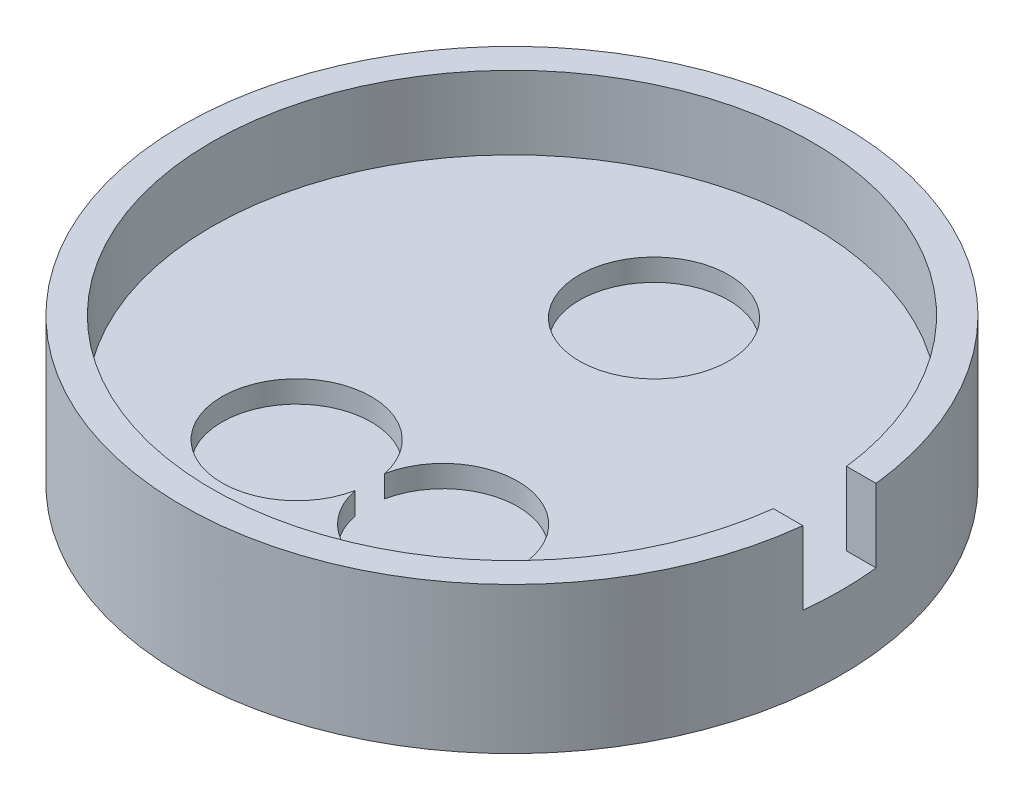
ISO-10303-21;
HEADER;
FILE_DESCRIPTION(('STEP AP214'),'2;1');
FILE_NAME('part.step','',(''),(''),'','','');
FILE_SCHEMA(('AUTOMOTIVE_DESIGN { 1 0 10303 214 1 1 1 1 }'));
ENDSEC;
DATA;
#1=APPLICATION_CONTEXT('core data for automotive mechanical design processes');
#2=APPLICATION_PROTOCOL_DEFINITION('international standard','automotive_design',2000,#1);
#3=PRODUCT_CONTEXT('',#1,'mechanical');
#4=PRODUCT('Part','Part','',(#3));
#5=PRODUCT_RELATED_PRODUCT_CATEGORY('part','',(#4));
#6=PRODUCT_DEFINITION_FORMATION('','',#4);
#7=PRODUCT_DEFINITION_CONTEXT('part definition',#1,'design');
#8=PRODUCT_DEFINITION('design','',#6,#7);
#9=PRODUCT_DEFINITION_SHAPE('','',#8);
#10=(LENGTH_UNIT() NAMED_UNIT(*) SI_UNIT(.MILLI.,.METRE.));
#11=(NAMED_UNIT(*) PLANE_ANGLE_UNIT() SI_UNIT($,.RADIAN.));
#12=(NAMED_UNIT(*) SI_UNIT($,.STERADIAN.) SOLID_ANGLE_UNIT());
#13=UNCERTAINTY_MEASURE_WITH_UNIT(LENGTH_MEASURE(1.E-05),#10,'distance_accuracy_value','');
#14=(GEOMETRIC_REPRESENTATION_CONTEXT(3) GLOBAL_UNCERTAINTY_ASSIGNED_CONTEXT((#13)) GLOBAL_UNIT_ASSIGNED_CONTEXT((#10,
#11,#12)) REPRESENTATION_CONTEXT('',''));
#15=CARTESIAN_POINT('',(0.,0.,0.));
#16=DIRECTION('',(0.,0.,1.));
#17=DIRECTION('',(1.,0.,0.));
#18=AXIS2_PLACEMENT_3D('',#15,#16,#17);
#19=CARTESIAN_POINT('',(0.,5.,0.));
#20=DIRECTION('',(0.,1.,0.));
#21=DIRECTION('',(0.,0.,1.));
#22=AXIS2_PLACEMENT_3D('',#19,#20,#21);
#23=PLANE('',#22);
#24=DIRECTION('',(-1.,0.,0.));
#25=VECTOR('',#24,1.);
#26=CARTESIAN_POINT('',(0.,5.,-2.5));
#27=LINE('',#26,#25);
#28=CARTESIAN_POINT('',(22.3606797749979,5.,-2.5));
#29=VERTEX_POINT('',#28);
#30=CARTESIAN_POINT('',(20.3469899493758,5.,-2.5));
#31=VERTEX_POINT('',#30);
#32=EDGE_CURVE('E154',#29,#31,#27,.T.);
#33=ORIENTED_EDGE('',*,*,#32,.F.);
#34=CARTESIAN_POINT('',(0.,5.,0.));
#35=DIRECTION('',(0.,1.,0.));
#36=DIRECTION('',(0.,0.,1.));
#37=AXIS2_PLACEMENT_3D('',#34,#35,#36);
#38=CIRCLE('',#37,22.5);
#39=CARTESIAN_POINT('',(22.3606797749979,5.,2.5));
#40=VERTEX_POINT('',#39);
#41=EDGE_CURVE('E12',#29,#40,#38,.T.);
#42=ORIENTED_EDGE('',*,*,#41,.T.);
#43=DIRECTION('',(1.,0.,0.));
#44=VECTOR('',#43,1.);
#45=CARTESIAN_POINT('',(0.,5.,2.5));
#46=LINE('',#45,#44);
#47=CARTESIAN_POINT('',(20.3469899493758,5.,2.5));
#48=VERTEX_POINT('',#47);
#49=EDGE_CURVE('E104',#48,#40,#46,.T.);
#50=ORIENTED_EDGE('',*,*,#49,.F.);
#51=CARTESIAN_POINT('',(0.,5.,0.));
#52=DIRECTION('',(0.,1.,0.));
#53=DIRECTION('',(0.,0.,1.));
#54=AXIS2_PLACEMENT_3D('',#51,#52,#53);
#55=CIRCLE('',#54,20.5);
#56=EDGE_CURVE('E53',#31,#48,#55,.T.);
#57=ORIENTED_EDGE('',*,*,#56,.F.);
#58=EDGE_LOOP('',(#33,#42,#50,#57));
#59=FACE_BOUND('',#58,.T.);
#60=ADVANCED_FACE('F45',(#59),#23,.T.);
#61=CARTESIAN_POINT('',(0.,5.,0.));
#62=DIRECTION('',(0.,-1.,0.));
#63=DIRECTION('',(0.,0.,-1.));
#64=AXIS2_PLACEMENT_3D('',#61,#62,#63);
#65=CYLINDRICAL_SURFACE('',#64,22.5);
#66=ORIENTED_EDGE('',*,*,#41,.F.);
#67=DIRECTION('',(0.,-1.,0.));
#68=VECTOR('',#67,1.);
#69=CARTESIAN_POINT('',(22.3606797749979,5.,-2.5));
#70=LINE('',#69,#68);
#71=CARTESIAN_POINT('',(22.3606797749979,0.,-2.5));
#72=VERTEX_POINT('',#71);
#73=EDGE_CURVE('E119',#29,#72,#70,.T.);
#74=ORIENTED_EDGE('',*,*,#73,.T.);
#75=CARTESIAN_POINT('',(0.,0.,0.));
#76=DIRECTION('',(0.,1.,0.));
#77=DIRECTION('',(0.,0.,1.));
#78=AXIS2_PLACEMENT_3D('',#75,#76,#77);
#79=CIRCLE('',#78,22.5);
#80=CARTESIAN_POINT('',(22.3606797749979,0.,2.5));
#81=VERTEX_POINT('',#80);
#82=EDGE_CURVE('E113',#81,#72,#79,.T.);
#83=ORIENTED_EDGE('',*,*,#82,.F.);
#84=DIRECTION('',(0.,-1.,0.));
#85=VECTOR('',#84,1.);
#86=CARTESIAN_POINT('',(22.3606797749979,5.,2.5));
#87=LINE('',#86,#85);
#88=EDGE_CURVE('E98',#81,#40,#87,.F.);
#89=ORIENTED_EDGE('',*,*,#88,.T.);
#90=EDGE_LOOP('',(#66,#74,#83,#89));
#91=FACE_BOUND('',#90,.T.);
#92=CARTESIAN_POINT('',(0.,-5.,0.));
#93=DIRECTION('',(0.,1.,0.));
#94=DIRECTION('',(0.,0.,1.));
#95=AXIS2_PLACEMENT_3D('',#92,#93,#94);
#96=CIRCLE('',#95,22.5);
#97=CARTESIAN_POINT('',(0.,-5.,22.5));
#98=VERTEX_POINT('',#97);
#99=EDGE_CURVE('E130',#98,#98,#96,.T.);
#100=ORIENTED_EDGE('',*,*,#99,.T.);
#101=EDGE_LOOP('',(#100));
#102=FACE_BOUND('',#101,.T.);
#103=ADVANCED_FACE('F47',(#91,#102),#65,.T.);
#104=CARTESIAN_POINT('',(0.,5.,0.));
#105=DIRECTION('',(0.,-1.,0.));
#106=DIRECTION('',(0.,0.,-1.));
#107=AXIS2_PLACEMENT_3D('',#104,#105,#106);
#108=CYLINDRICAL_SURFACE('',#107,20.5);
#109=DIRECTION('',(0.,-1.,0.));
#110=VECTOR('',#109,1.);
#111=CARTESIAN_POINT('',(20.3469899493758,5.,-2.5));
#112=LINE('',#111,#110);
#113=CARTESIAN_POINT('',(20.3469899493758,0.,-2.5));
#114=VERTEX_POINT('',#113);
#115=EDGE_CURVE('E108',#31,#114,#112,.T.);
#116=ORIENTED_EDGE('',*,*,#115,.F.);
#117=ORIENTED_EDGE('',*,*,#56,.T.);
#118=DIRECTION('',(0.,-1.,0.));
#119=VECTOR('',#118,1.);
#120=CARTESIAN_POINT('',(20.3469899493758,5.,2.5));
#121=LINE('',#120,#119);
#122=CARTESIAN_POINT('',(20.3469899493758,0.,2.5));
#123=VERTEX_POINT('',#122);
#124=EDGE_CURVE('E109',#123,#48,#121,.F.);
#125=ORIENTED_EDGE('',*,*,#124,.F.);
#126=CARTESIAN_POINT('',(0.,0.,0.));
#127=DIRECTION('',(0.,1.,0.));
#128=DIRECTION('',(0.,0.,1.));
#129=AXIS2_PLACEMENT_3D('',#126,#127,#128);
#130=CIRCLE('',#129,20.5);
#131=EDGE_CURVE('E115',#114,#123,#130,.T.);
#132=ORIENTED_EDGE('',*,*,#131,.F.);
#133=EDGE_LOOP('',(#116,#117,#125,#132));
#134=FACE_BOUND('',#133,.T.);
#135=ADVANCED_FACE('F151',(#134),#108,.F.);
#136=CARTESIAN_POINT('',(0.,0.,0.));
#137=DIRECTION('',(0.,1.,0.));
#138=DIRECTION('',(0.,0.,1.));
#139=AXIS2_PLACEMENT_3D('',#136,#137,#138);
#140=PLANE('',#139);
#141=ORIENTED_EDGE('',*,*,#131,.T.);
#142=DIRECTION('',(-1.,0.,0.));
#143=VECTOR('',#142,1.);
#144=CARTESIAN_POINT('',(0.,0.,2.5));
#145=LINE('',#144,#143);
#146=EDGE_CURVE('E101',#81,#123,#145,.T.);
#147=ORIENTED_EDGE('',*,*,#146,.F.);
#148=ORIENTED_EDGE('',*,*,#82,.T.);
#149=DIRECTION('',(1.,0.,0.));
#150=VECTOR('',#149,1.);
#151=CARTESIAN_POINT('',(0.,0.,-2.5));
#152=LINE('',#151,#150);
#153=EDGE_CURVE('E60',#114,#72,#152,.T.);
#154=ORIENTED_EDGE('',*,*,#153,.F.);
#155=EDGE_LOOP('',(#141,#147,#148,#154));
#156=FACE_BOUND('',#155,.T.);
#157=CARTESIAN_POINT('',(0.,0.,-9.7));
#158=DIRECTION('',(0.,1.,0.));
#159=DIRECTION('',(0.,0.,1.));
#160=AXIS2_PLACEMENT_3D('',#157,#158,#159);
#161=CIRCLE('',#160,5.1);
#162=CARTESIAN_POINT('',(0.,0.,-4.6));
#163=VERTEX_POINT('',#162);
#164=EDGE_CURVE('E131',#163,#163,#161,.T.);
#165=ORIENTED_EDGE('',*,*,#164,.F.);
#166=EDGE_LOOP('',(#165));
#167=FACE_BOUND('',#166,.T.);
#168=CARTESIAN_POINT('',(5.,0.,9.7));
#169=DIRECTION('',(0.,1.,0.));
#170=DIRECTION('',(0.,0.,1.));
#171=AXIS2_PLACEMENT_3D('',#168,#169,#170);
#172=CIRCLE('',#171,5.1);
#173=CARTESIAN_POINT('',(0.,0.,10.7049875621121));
#174=VERTEX_POINT('',#173);
#175=CARTESIAN_POINT('',(0.,0.,8.69501243788791));
#176=VERTEX_POINT('',#175);
#177=EDGE_CURVE('E68',#174,#176,#172,.T.);
#178=ORIENTED_EDGE('',*,*,#177,.F.);
#179=CARTESIAN_POINT('',(-5.,0.,9.7));
#180=DIRECTION('',(0.,1.,0.));
#181=DIRECTION('',(0.,0.,1.));
#182=AXIS2_PLACEMENT_3D('',#179,#180,#181);
#183=CIRCLE('',#182,5.1);
#184=EDGE_CURVE('E133',#176,#174,#183,.T.);
#185=ORIENTED_EDGE('',*,*,#184,.F.);
#186=EDGE_LOOP('',(#178,#185));
#187=FACE_BOUND('',#186,.T.);
#188=ADVANCED_FACE('F111',(#156,#167,#187),#140,.T.);
#189=CARTESIAN_POINT('',(0.,-5.,0.));
#190=DIRECTION('',(0.,1.,0.));
#191=DIRECTION('',(0.,0.,1.));
#192=AXIS2_PLACEMENT_3D('',#189,#190,#191);
#193=PLANE('',#192);
#194=CARTESIAN_POINT('',(-10.,-5.,0.));
#195=DIRECTION('',(0.,-1.,0.));
#196=DIRECTION('',(0.,0.,-1.));
#197=AXIS2_PLACEMENT_3D('',#194,#195,#196);
#198=CIRCLE('',#197,0.6);
#199=CARTESIAN_POINT('',(-10.,-5.,-0.600000000000004));
#200=VERTEX_POINT('',#199);
#201=EDGE_CURVE('E159',#200,#200,#198,.T.);
#202=ORIENTED_EDGE('',*,*,#201,.F.);
#203=EDGE_LOOP('',(#202));
#204=FACE_BOUND('',#203,.T.);
#205=CARTESIAN_POINT('',(10.,-5.,0.));
#206=DIRECTION('',(0.,-1.,0.));
#207=DIRECTION('',(0.,0.,-1.));
#208=AXIS2_PLACEMENT_3D('',#205,#206,#207);
#209=CIRCLE('',#208,0.6);
#210=CARTESIAN_POINT('',(10.,-5.,-0.6));
#211=VERTEX_POINT('',#210);
#212=EDGE_CURVE('E360',#211,#211,#209,.T.);
#213=ORIENTED_EDGE('',*,*,#212,.F.);
#214=EDGE_LOOP('',(#213));
#215=FACE_BOUND('',#214,.T.);
#216=ORIENTED_EDGE('',*,*,#99,.F.);
#217=EDGE_LOOP('',(#216));
#218=FACE_BOUND('',#217,.T.);
#219=ADVANCED_FACE('F188',(#204,#215,#218),#193,.F.);
#220=CARTESIAN_POINT('',(5.,-1.5,9.7));
#221=DIRECTION('',(0.,1.,0.));
#222=DIRECTION('',(0.,0.,1.));
#223=AXIS2_PLACEMENT_3D('',#220,#221,#222);
#224=PLANE('',#223);
#225=CARTESIAN_POINT('',(-5.,-1.5,9.7));
#226=DIRECTION('',(0.,1.,0.));
#227=DIRECTION('',(0.,0.,1.));
#228=AXIS2_PLACEMENT_3D('',#225,#226,#227);
#229=CIRCLE('',#228,5.1);
#230=CARTESIAN_POINT('',(0.,-1.5,8.69501243788791));
#231=VERTEX_POINT('',#230);
#232=CARTESIAN_POINT('',(0.,-1.5,10.7049875621121));
#233=VERTEX_POINT('',#232);
#234=EDGE_CURVE('E139',#231,#233,#229,.T.);
#235=ORIENTED_EDGE('',*,*,#234,.T.);
#236=CARTESIAN_POINT('',(5.,-1.5,9.7));
#237=DIRECTION('',(0.,1.,0.));
#238=DIRECTION('',(0.,0.,1.));
#239=AXIS2_PLACEMENT_3D('',#236,#237,#238);
#240=CIRCLE('',#239,5.1);
#241=EDGE_CURVE('E136',#233,#231,#240,.T.);
#242=ORIENTED_EDGE('',*,*,#241,.T.);
#243=EDGE_LOOP('',(#235,#242));
#244=FACE_BOUND('',#243,.T.);
#245=ADVANCED_FACE('F191',(#244),#224,.T.);
#246=CARTESIAN_POINT('',(5.,-1.5,9.7));
#247=DIRECTION('',(0.,1.,0.));
#248=DIRECTION('',(0.,0.,1.));
#249=AXIS2_PLACEMENT_3D('',#246,#247,#248);
#250=CYLINDRICAL_SURFACE('',#249,5.1);
#251=DIRECTION('',(0.,1.,0.));
#252=VECTOR('',#251,1.);
#253=CARTESIAN_POINT('',(0.,-0.75,10.7049875621121));
#254=LINE('',#253,#252);
#255=EDGE_CURVE('E120',#233,#174,#254,.T.);
#256=ORIENTED_EDGE('',*,*,#255,.T.);
#257=ORIENTED_EDGE('',*,*,#177,.T.);
#258=DIRECTION('',(0.,1.,0.));
#259=VECTOR('',#258,1.);
#260=CARTESIAN_POINT('',(0.,-0.75,8.69501243788791));
#261=LINE('',#260,#259);
#262=EDGE_CURVE('E122',#176,#231,#261,.F.);
#263=ORIENTED_EDGE('',*,*,#262,.T.);
#264=ORIENTED_EDGE('',*,*,#241,.F.);
#265=EDGE_LOOP('',(#256,#257,#263,#264));
#266=FACE_BOUND('',#265,.T.);
#267=ADVANCED_FACE('F193',(#266),#250,.F.);
#268=CARTESIAN_POINT('',(-5.,-1.5,9.7));
#269=DIRECTION('',(0.,1.,0.));
#270=DIRECTION('',(0.,0.,1.));
#271=AXIS2_PLACEMENT_3D('',#268,#269,#270);
#272=CYLINDRICAL_SURFACE('',#271,5.1);
#273=ORIENTED_EDGE('',*,*,#234,.F.);
#274=ORIENTED_EDGE('',*,*,#262,.F.);
#275=ORIENTED_EDGE('',*,*,#184,.T.);
#276=ORIENTED_EDGE('',*,*,#255,.F.);
#277=EDGE_LOOP('',(#273,#274,#275,#276));
#278=FACE_BOUND('',#277,.T.);
#279=ADVANCED_FACE('F197',(#278),#272,.F.);
#280=CARTESIAN_POINT('',(0.,-1.5,-9.7));
#281=DIRECTION('',(0.,1.,0.));
#282=DIRECTION('',(0.,0.,1.));
#283=AXIS2_PLACEMENT_3D('',#280,#281,#282);
#284=CYLINDRICAL_SURFACE('',#283,5.1);
#285=CARTESIAN_POINT('',(0.,-1.5,-9.7));
#286=DIRECTION('',(0.,1.,0.));
#287=DIRECTION('',(0.,0.,1.));
#288=AXIS2_PLACEMENT_3D('',#285,#286,#287);
#289=CIRCLE('',#288,5.1);
#290=CARTESIAN_POINT('',(0.,-1.5,-4.6));
#291=VERTEX_POINT('',#290);
#292=EDGE_CURVE('E127',#291,#291,#289,.T.);
#293=ORIENTED_EDGE('',*,*,#292,.F.);
#294=EDGE_LOOP('',(#293));
#295=FACE_BOUND('',#294,.T.);
#296=ORIENTED_EDGE('',*,*,#164,.T.);
#297=EDGE_LOOP('',(#296));
#298=FACE_BOUND('',#297,.T.);
#299=ADVANCED_FACE('F175',(#295,#298),#284,.F.);
#300=CARTESIAN_POINT('',(0.,-1.5,-9.7));
#301=DIRECTION('',(0.,1.,0.));
#302=DIRECTION('',(0.,0.,1.));
#303=AXIS2_PLACEMENT_3D('',#300,#301,#302);
#304=PLANE('',#303);
#305=ORIENTED_EDGE('',*,*,#292,.T.);
#306=EDGE_LOOP('',(#305));
#307=FACE_BOUND('',#306,.T.);
#308=ADVANCED_FACE('F167',(#307),#304,.T.);
#309=CARTESIAN_POINT('',(0.,-30.4138126514911,-2.5));
#310=DIRECTION('',(0.,0.,-1.));
#311=DIRECTION('',(-1.,0.,0.));
#312=AXIS2_PLACEMENT_3D('',#309,#310,#311);
#313=PLANE('',#312);
#314=ORIENTED_EDGE('',*,*,#32,.T.);
#315=ORIENTED_EDGE('',*,*,#115,.T.);
#316=ORIENTED_EDGE('',*,*,#153,.T.);
#317=ORIENTED_EDGE('',*,*,#73,.F.);
#318=EDGE_LOOP('',(#314,#315,#316,#317));
#319=FACE_BOUND('',#318,.T.);
#320=ADVANCED_FACE('F165',(#319),#313,.F.);
#321=CARTESIAN_POINT('',(0.,-30.4138126514911,2.5));
#322=DIRECTION('',(0.,0.,1.));
#323=DIRECTION('',(1.,0.,0.));
#324=AXIS2_PLACEMENT_3D('',#321,#322,#323);
#325=PLANE('',#324);
#326=ORIENTED_EDGE('',*,*,#146,.T.);
#327=ORIENTED_EDGE('',*,*,#124,.T.);
#328=ORIENTED_EDGE('',*,*,#49,.T.);
#329=ORIENTED_EDGE('',*,*,#88,.F.);
#330=EDGE_LOOP('',(#326,#327,#328,#329));
#331=FACE_BOUND('',#330,.T.);
#332=ADVANCED_FACE('F100',(#331),#325,.F.);
#333=CARTESIAN_POINT('',(10.,-2.,0.));
#334=DIRECTION('',(0.,-1.,0.));
#335=DIRECTION('',(0.,0.,-1.));
#336=AXIS2_PLACEMENT_3D('',#333,#334,#335);
#337=CYLINDRICAL_SURFACE('',#336,0.6);
#338=CARTESIAN_POINT('',(10.,-2.,0.));
#339=DIRECTION('',(0.,-1.,0.));
#340=DIRECTION('',(0.,0.,-1.));
#341=AXIS2_PLACEMENT_3D('',#338,#339,#340);
#342=CIRCLE('',#341,0.6);
#343=CARTESIAN_POINT('',(10.,-2.,-0.6));
#344=VERTEX_POINT('',#343);
#345=EDGE_CURVE('E363',#344,#344,#342,.T.);
#346=ORIENTED_EDGE('',*,*,#345,.F.);
#347=EDGE_LOOP('',(#346));
#348=FACE_BOUND('',#347,.T.);
#349=ORIENTED_EDGE('',*,*,#212,.T.);
#350=EDGE_LOOP('',(#349));
#351=FACE_BOUND('',#350,.T.);
#352=ADVANCED_FACE('F173',(#348,#351),#337,.F.);
#353=CARTESIAN_POINT('',(10.,-2.,0.));
#354=DIRECTION('',(0.,-1.,0.));
#355=DIRECTION('',(0.,0.,-1.));
#356=AXIS2_PLACEMENT_3D('',#353,#354,#355);
#357=PLANE('',#356);
#358=ORIENTED_EDGE('',*,*,#345,.T.);
#359=EDGE_LOOP('',(#358));
#360=FACE_BOUND('',#359,.T.);
#361=ADVANCED_FACE('F272',(#360),#357,.T.);
#362=CARTESIAN_POINT('',(-10.,-2.,0.));
#363=DIRECTION('',(0.,-1.,0.));
#364=DIRECTION('',(0.,0.,-1.));
#365=AXIS2_PLACEMENT_3D('',#362,#363,#364);
#366=CYLINDRICAL_SURFACE('',#365,0.6);
#367=CARTESIAN_POINT('',(-10.,-2.,0.));
#368=DIRECTION('',(0.,-1.,0.));
#369=DIRECTION('',(0.,0.,-1.));
#370=AXIS2_PLACEMENT_3D('',#367,#368,#369);
#371=CIRCLE('',#370,0.6);
#372=CARTESIAN_POINT('',(-10.,-2.,-0.600000000000004));
#373=VERTEX_POINT('',#372);
#374=EDGE_CURVE('E155',#373,#373,#371,.T.);
#375=ORIENTED_EDGE('',*,*,#374,.F.);
#376=EDGE_LOOP('',(#375));
#377=FACE_BOUND('',#376,.T.);
#378=ORIENTED_EDGE('',*,*,#201,.T.);
#379=EDGE_LOOP('',(#378));
#380=FACE_BOUND('',#379,.T.);
#381=ADVANCED_FACE('F283',(#377,#380),#366,.F.);
#382=CARTESIAN_POINT('',(-10.,-2.,0.));
#383=DIRECTION('',(0.,-1.,0.));
#384=DIRECTION('',(0.,0.,-1.));
#385=AXIS2_PLACEMENT_3D('',#382,#383,#384);
#386=PLANE('',#385);
#387=ORIENTED_EDGE('',*,*,#374,.T.);
#388=EDGE_LOOP('',(#387));
#389=FACE_BOUND('',#388,.T.);
#390=ADVANCED_FACE('F293',(#389),#386,.T.);
#391=CLOSED_SHELL('',(#60,#103,#135,#188,#219,#245,#267,#279,#299,#308,#320,#332,#352,#361,#381,#390));
#392=MANIFOLD_SOLID_BREP('B2',#391);
#393=ADVANCED_BREP_SHAPE_REPRESENTATION('',(#18,#392),#14);
#394=SHAPE_DEFINITION_REPRESENTATION(#9,#393);
ENDSEC;
END-ISO-10303-21;
